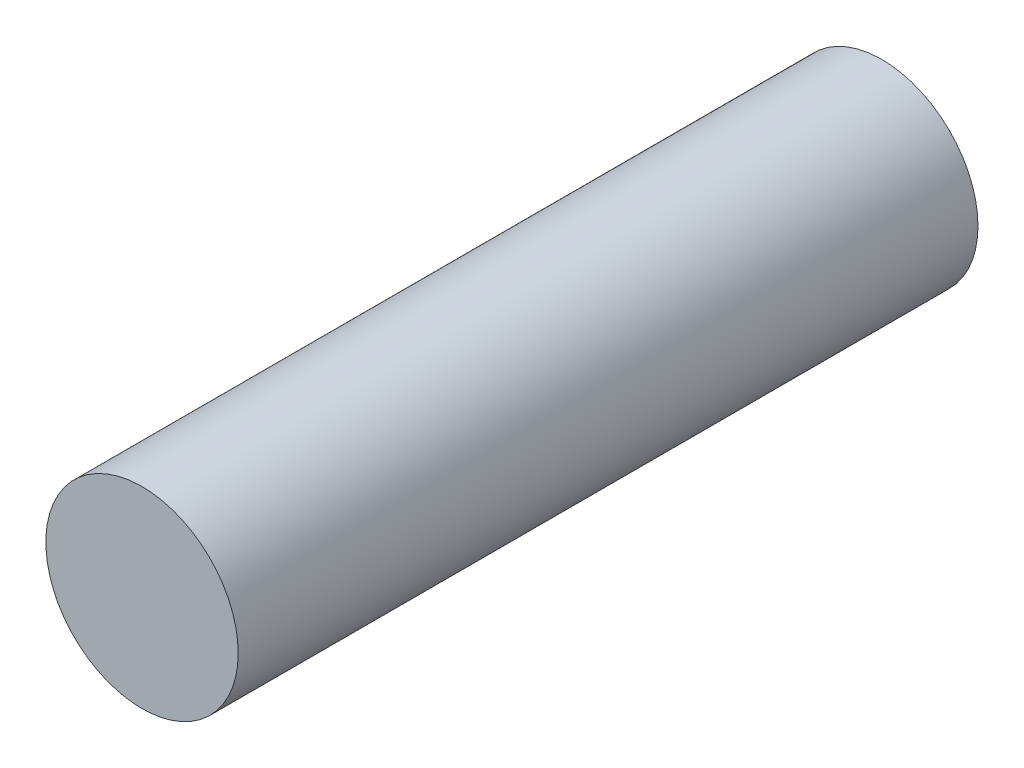
ISO-10303-21;
HEADER;
FILE_DESCRIPTION(('STEP AP214'),'2;1');
FILE_NAME('part.step','',(''),(''),'','','');
FILE_SCHEMA(('AUTOMOTIVE_DESIGN { 1 0 10303 214 1 1 1 1 }'));
ENDSEC;
DATA;
#1=APPLICATION_CONTEXT('core data for automotive mechanical design processes');
#2=APPLICATION_PROTOCOL_DEFINITION('international standard','automotive_design',2000,#1);
#3=PRODUCT_CONTEXT('',#1,'mechanical');
#4=PRODUCT('Part','Part','',(#3));
#5=PRODUCT_RELATED_PRODUCT_CATEGORY('part','',(#4));
#6=PRODUCT_DEFINITION_FORMATION('','',#4);
#7=PRODUCT_DEFINITION_CONTEXT('part definition',#1,'design');
#8=PRODUCT_DEFINITION('design','',#6,#7);
#9=PRODUCT_DEFINITION_SHAPE('','',#8);
#10=(LENGTH_UNIT() NAMED_UNIT(*) SI_UNIT(.MILLI.,.METRE.));
#11=(NAMED_UNIT(*) PLANE_ANGLE_UNIT() SI_UNIT($,.RADIAN.));
#12=(NAMED_UNIT(*) SI_UNIT($,.STERADIAN.) SOLID_ANGLE_UNIT());
#13=UNCERTAINTY_MEASURE_WITH_UNIT(LENGTH_MEASURE(1.E-05),#10,'distance_accuracy_value','');
#14=(GEOMETRIC_REPRESENTATION_CONTEXT(3) GLOBAL_UNCERTAINTY_ASSIGNED_CONTEXT((#13)) GLOBAL_UNIT_ASSIGNED_CONTEXT((#10,
#11,#12)) REPRESENTATION_CONTEXT('',''));
#15=CARTESIAN_POINT('',(0.,0.,0.));
#16=DIRECTION('',(0.,0.,1.));
#17=DIRECTION('',(1.,0.,0.));
#18=AXIS2_PLACEMENT_3D('',#15,#16,#17);
#19=CARTESIAN_POINT('',(0.,0.,100.));
#20=DIRECTION('',(0.,0.,-1.));
#21=DIRECTION('',(-1.,0.,0.));
#22=AXIS2_PLACEMENT_3D('',#19,#20,#21);
#23=CYLINDRICAL_SURFACE('',#22,10.);
#24=CARTESIAN_POINT('',(0.,0.,0.));
#25=DIRECTION('',(0.,0.,1.));
#26=DIRECTION('',(1.,0.,0.));
#27=AXIS2_PLACEMENT_3D('',#24,#25,#26);
#28=CIRCLE('',#27,10.);
#29=CARTESIAN_POINT('',(10.,0.,0.));
#30=VERTEX_POINT('',#29);
#31=EDGE_CURVE('E52',#30,#30,#28,.T.);
#32=ORIENTED_EDGE('',*,*,#31,.F.);
#33=EDGE_LOOP('',(#32));
#34=FACE_BOUND('',#33,.T.);
#35=CARTESIAN_POINT('',(0.,0.,95.));
#36=DIRECTION('',(0.,0.,1.));
#37=DIRECTION('',(1.,0.,0.));
#38=AXIS2_PLACEMENT_3D('',#35,#36,#37);
#39=CIRCLE('',#38,10.);
#40=CARTESIAN_POINT('',(10.,0.,95.));
#41=VERTEX_POINT('',#40);
#42=EDGE_CURVE('E41',#41,#41,#39,.T.);
#43=ORIENTED_EDGE('',*,*,#42,.T.);
#44=EDGE_LOOP('',(#43));
#45=FACE_BOUND('',#44,.T.);
#46=ADVANCED_FACE('F37',(#34,#45),#23,.F.);
#47=CARTESIAN_POINT('',(0.,0.,100.));
#48=DIRECTION('',(0.,0.,1.));
#49=DIRECTION('',(1.,0.,0.));
#50=AXIS2_PLACEMENT_3D('',#47,#48,#49);
#51=PLANE('',#50);
#52=CARTESIAN_POINT('',(0.,0.,100.));
#53=DIRECTION('',(0.,0.,1.));
#54=DIRECTION('',(1.,0.,0.));
#55=AXIS2_PLACEMENT_3D('',#52,#53,#54);
#56=CIRCLE('',#55,13.);
#57=CARTESIAN_POINT('',(13.,0.,100.));
#58=VERTEX_POINT('',#57);
#59=EDGE_CURVE('E10',#58,#58,#56,.T.);
#60=ORIENTED_EDGE('',*,*,#59,.T.);
#61=EDGE_LOOP('',(#60));
#62=FACE_BOUND('',#61,.T.);
#63=ADVANCED_FACE('F110',(#62),#51,.T.);
#64=CARTESIAN_POINT('',(0.,0.,0.));
#65=DIRECTION('',(0.,0.,1.));
#66=DIRECTION('',(1.,0.,0.));
#67=AXIS2_PLACEMENT_3D('',#64,#65,#66);
#68=PLANE('',#67);
#69=CARTESIAN_POINT('',(0.,11.5,0.));
#70=DIRECTION('',(0.,0.,-1.));
#71=DIRECTION('',(-1.,0.,0.));
#72=AXIS2_PLACEMENT_3D('',#69,#70,#71);
#73=CIRCLE('',#72,1.);
#74=CARTESIAN_POINT('',(-1.,11.5,0.));
#75=VERTEX_POINT('',#74);
#76=EDGE_CURVE('E81',#75,#75,#73,.T.);
#77=ORIENTED_EDGE('',*,*,#76,.F.);
#78=EDGE_LOOP('',(#77));
#79=FACE_BOUND('',#78,.T.);
#80=CARTESIAN_POINT('',(-11.5,0.,0.));
#81=DIRECTION('',(0.,0.,-1.));
#82=DIRECTION('',(-1.,0.,0.));
#83=AXIS2_PLACEMENT_3D('',#80,#81,#82);
#84=CIRCLE('',#83,1.);
#85=CARTESIAN_POINT('',(-12.5,0.,0.));
#86=VERTEX_POINT('',#85);
#87=EDGE_CURVE('E73',#86,#86,#84,.T.);
#88=ORIENTED_EDGE('',*,*,#87,.F.);
#89=EDGE_LOOP('',(#88));
#90=FACE_BOUND('',#89,.T.);
#91=CARTESIAN_POINT('',(-3.22624626992588E-13,-11.5,0.));
#92=DIRECTION('',(0.,0.,-1.));
#93=DIRECTION('',(-1.,0.,0.));
#94=AXIS2_PLACEMENT_3D('',#91,#92,#93);
#95=CIRCLE('',#94,1.00000000000039);
#96=CARTESIAN_POINT('',(-1.00000000000071,-11.5,0.));
#97=VERTEX_POINT('',#96);
#98=EDGE_CURVE('E65',#97,#97,#95,.T.);
#99=ORIENTED_EDGE('',*,*,#98,.F.);
#100=EDGE_LOOP('',(#99));
#101=FACE_BOUND('',#100,.T.);
#102=CARTESIAN_POINT('',(11.4999999999998,-1.62720657315313E-13,0.));
#103=DIRECTION('',(0.,0.,-1.));
#104=DIRECTION('',(-1.,0.,0.));
#105=AXIS2_PLACEMENT_3D('',#102,#103,#104);
#106=CIRCLE('',#105,1.00000000000032);
#107=CARTESIAN_POINT('',(10.4999999999995,-1.62720657315313E-13,0.));
#108=VERTEX_POINT('',#107);
#109=EDGE_CURVE('E57',#108,#108,#106,.T.);
#110=ORIENTED_EDGE('',*,*,#109,.F.);
#111=EDGE_LOOP('',(#110));
#112=FACE_BOUND('',#111,.T.);
#113=CARTESIAN_POINT('',(0.,0.,0.));
#114=DIRECTION('',(0.,0.,1.));
#115=DIRECTION('',(1.,0.,0.));
#116=AXIS2_PLACEMENT_3D('',#113,#114,#115);
#117=CIRCLE('',#116,13.);
#118=CARTESIAN_POINT('',(13.,0.,0.));
#119=VERTEX_POINT('',#118);
#120=EDGE_CURVE('E46',#119,#119,#117,.T.);
#121=ORIENTED_EDGE('',*,*,#120,.F.);
#122=EDGE_LOOP('',(#121));
#123=FACE_BOUND('',#122,.T.);
#124=ORIENTED_EDGE('',*,*,#31,.T.);
#125=EDGE_LOOP('',(#124));
#126=FACE_BOUND('',#125,.T.);
#127=ADVANCED_FACE('F106',(#79,#90,#101,#112,#123,#126),#68,.F.);
#128=CARTESIAN_POINT('',(0.,0.,100.));
#129=DIRECTION('',(0.,0.,-1.));
#130=DIRECTION('',(-1.,0.,0.));
#131=AXIS2_PLACEMENT_3D('',#128,#129,#130);
#132=CYLINDRICAL_SURFACE('',#131,13.);
#133=ORIENTED_EDGE('',*,*,#59,.F.);
#134=EDGE_LOOP('',(#133));
#135=FACE_BOUND('',#134,.T.);
#136=ORIENTED_EDGE('',*,*,#120,.T.);
#137=EDGE_LOOP('',(#136));
#138=FACE_BOUND('',#137,.T.);
#139=ADVANCED_FACE('F39',(#135,#138),#132,.T.);
#140=CARTESIAN_POINT('',(0.,0.,95.));
#141=DIRECTION('',(0.,0.,1.));
#142=DIRECTION('',(1.,0.,0.));
#143=AXIS2_PLACEMENT_3D('',#140,#141,#142);
#144=PLANE('',#143);
#145=ORIENTED_EDGE('',*,*,#42,.F.);
#146=EDGE_LOOP('',(#145));
#147=FACE_BOUND('',#146,.T.);
#148=ADVANCED_FACE('F95',(#147),#144,.F.);
#149=CARTESIAN_POINT('',(11.4999999999998,-1.62720657315313E-13,5.));
#150=DIRECTION('',(0.,0.,-1.));
#151=DIRECTION('',(-1.,0.,0.));
#152=AXIS2_PLACEMENT_3D('',#149,#150,#151);
#153=CYLINDRICAL_SURFACE('',#152,1.00000000000032);
#154=CARTESIAN_POINT('',(11.4999999999998,-1.62720657315313E-13,5.));
#155=DIRECTION('',(0.,0.,-1.));
#156=DIRECTION('',(-1.,0.,0.));
#157=AXIS2_PLACEMENT_3D('',#154,#155,#156);
#158=CIRCLE('',#157,1.00000000000032);
#159=CARTESIAN_POINT('',(10.4999999999995,-1.62720657315313E-13,5.));
#160=VERTEX_POINT('',#159);
#161=EDGE_CURVE('E61',#160,#160,#158,.T.);
#162=ORIENTED_EDGE('',*,*,#161,.F.);
#163=EDGE_LOOP('',(#162));
#164=FACE_BOUND('',#163,.T.);
#165=ORIENTED_EDGE('',*,*,#109,.T.);
#166=EDGE_LOOP('',(#165));
#167=FACE_BOUND('',#166,.T.);
#168=ADVANCED_FACE('F97',(#164,#167),#153,.F.);
#169=CARTESIAN_POINT('',(11.4999999999998,-1.62720657315313E-13,5.));
#170=DIRECTION('',(0.,0.,-1.));
#171=DIRECTION('',(-1.,0.,0.));
#172=AXIS2_PLACEMENT_3D('',#169,#170,#171);
#173=PLANE('',#172);
#174=ORIENTED_EDGE('',*,*,#161,.T.);
#175=EDGE_LOOP('',(#174));
#176=FACE_BOUND('',#175,.T.);
#177=ADVANCED_FACE('F103',(#176),#173,.T.);
#178=CARTESIAN_POINT('',(-3.22624626992588E-13,-11.5,5.));
#179=DIRECTION('',(0.,0.,-1.));
#180=DIRECTION('',(-1.,0.,0.));
#181=AXIS2_PLACEMENT_3D('',#178,#179,#180);
#182=CYLINDRICAL_SURFACE('',#181,1.00000000000039);
#183=CARTESIAN_POINT('',(-3.22624626992588E-13,-11.5,5.));
#184=DIRECTION('',(0.,0.,-1.));
#185=DIRECTION('',(-1.,0.,0.));
#186=AXIS2_PLACEMENT_3D('',#183,#184,#185);
#187=CIRCLE('',#186,1.00000000000039);
#188=CARTESIAN_POINT('',(-1.00000000000071,-11.5,5.));
#189=VERTEX_POINT('',#188);
#190=EDGE_CURVE('E69',#189,#189,#187,.T.);
#191=ORIENTED_EDGE('',*,*,#190,.F.);
#192=EDGE_LOOP('',(#191));
#193=FACE_BOUND('',#192,.T.);
#194=ORIENTED_EDGE('',*,*,#98,.T.);
#195=EDGE_LOOP('',(#194));
#196=FACE_BOUND('',#195,.T.);
#197=ADVANCED_FACE('F134',(#193,#196),#182,.F.);
#198=CARTESIAN_POINT('',(-3.22624626992588E-13,-11.5,5.));
#199=DIRECTION('',(0.,0.,-1.));
#200=DIRECTION('',(-1.,0.,0.));
#201=AXIS2_PLACEMENT_3D('',#198,#199,#200);
#202=PLANE('',#201);
#203=ORIENTED_EDGE('',*,*,#190,.T.);
#204=EDGE_LOOP('',(#203));
#205=FACE_BOUND('',#204,.T.);
#206=ADVANCED_FACE('F136',(#205),#202,.T.);
#207=CARTESIAN_POINT('',(-11.5,0.,5.));
#208=DIRECTION('',(0.,0.,-1.));
#209=DIRECTION('',(-1.,0.,0.));
#210=AXIS2_PLACEMENT_3D('',#207,#208,#209);
#211=CYLINDRICAL_SURFACE('',#210,1.);
#212=CARTESIAN_POINT('',(-11.5,0.,5.));
#213=DIRECTION('',(0.,0.,-1.));
#214=DIRECTION('',(-1.,0.,0.));
#215=AXIS2_PLACEMENT_3D('',#212,#213,#214);
#216=CIRCLE('',#215,1.);
#217=CARTESIAN_POINT('',(-12.5,0.,5.));
#218=VERTEX_POINT('',#217);
#219=EDGE_CURVE('E77',#218,#218,#216,.T.);
#220=ORIENTED_EDGE('',*,*,#219,.F.);
#221=EDGE_LOOP('',(#220));
#222=FACE_BOUND('',#221,.T.);
#223=ORIENTED_EDGE('',*,*,#87,.T.);
#224=EDGE_LOOP('',(#223));
#225=FACE_BOUND('',#224,.T.);
#226=ADVANCED_FACE('F143',(#222,#225),#211,.F.);
#227=CARTESIAN_POINT('',(-11.5,0.,5.));
#228=DIRECTION('',(0.,0.,-1.));
#229=DIRECTION('',(-1.,0.,0.));
#230=AXIS2_PLACEMENT_3D('',#227,#228,#229);
#231=PLANE('',#230);
#232=ORIENTED_EDGE('',*,*,#219,.T.);
#233=EDGE_LOOP('',(#232));
#234=FACE_BOUND('',#233,.T.);
#235=ADVANCED_FACE('F152',(#234),#231,.T.);
#236=CARTESIAN_POINT('',(0.,11.5,5.));
#237=DIRECTION('',(0.,0.,-1.));
#238=DIRECTION('',(-1.,0.,0.));
#239=AXIS2_PLACEMENT_3D('',#236,#237,#238);
#240=CYLINDRICAL_SURFACE('',#239,1.);
#241=CARTESIAN_POINT('',(0.,11.5,5.));
#242=DIRECTION('',(0.,0.,-1.));
#243=DIRECTION('',(-1.,0.,0.));
#244=AXIS2_PLACEMENT_3D('',#241,#242,#243);
#245=CIRCLE('',#244,1.);
#246=CARTESIAN_POINT('',(-1.,11.5,5.));
#247=VERTEX_POINT('',#246);
#248=EDGE_CURVE('E85',#247,#247,#245,.T.);
#249=ORIENTED_EDGE('',*,*,#248,.F.);
#250=EDGE_LOOP('',(#249));
#251=FACE_BOUND('',#250,.T.);
#252=ORIENTED_EDGE('',*,*,#76,.T.);
#253=EDGE_LOOP('',(#252));
#254=FACE_BOUND('',#253,.T.);
#255=ADVANCED_FACE('F156',(#251,#254),#240,.F.);
#256=CARTESIAN_POINT('',(0.,11.5,5.));
#257=DIRECTION('',(0.,0.,-1.));
#258=DIRECTION('',(-1.,0.,0.));
#259=AXIS2_PLACEMENT_3D('',#256,#257,#258);
#260=PLANE('',#259);
#261=ORIENTED_EDGE('',*,*,#248,.T.);
#262=EDGE_LOOP('',(#261));
#263=FACE_BOUND('',#262,.T.);
#264=ADVANCED_FACE('F160',(#263),#260,.T.);
#265=CLOSED_SHELL('',(#46,#63,#127,#139,#148,#168,#177,#197,#206,#226,#235,#255,#264));
#266=MANIFOLD_SOLID_BREP('B2',#265);
#267=ADVANCED_BREP_SHAPE_REPRESENTATION('',(#18,#266),#14);
#268=SHAPE_DEFINITION_REPRESENTATION(#9,#267);
ENDSEC;
END-ISO-10303-21;
